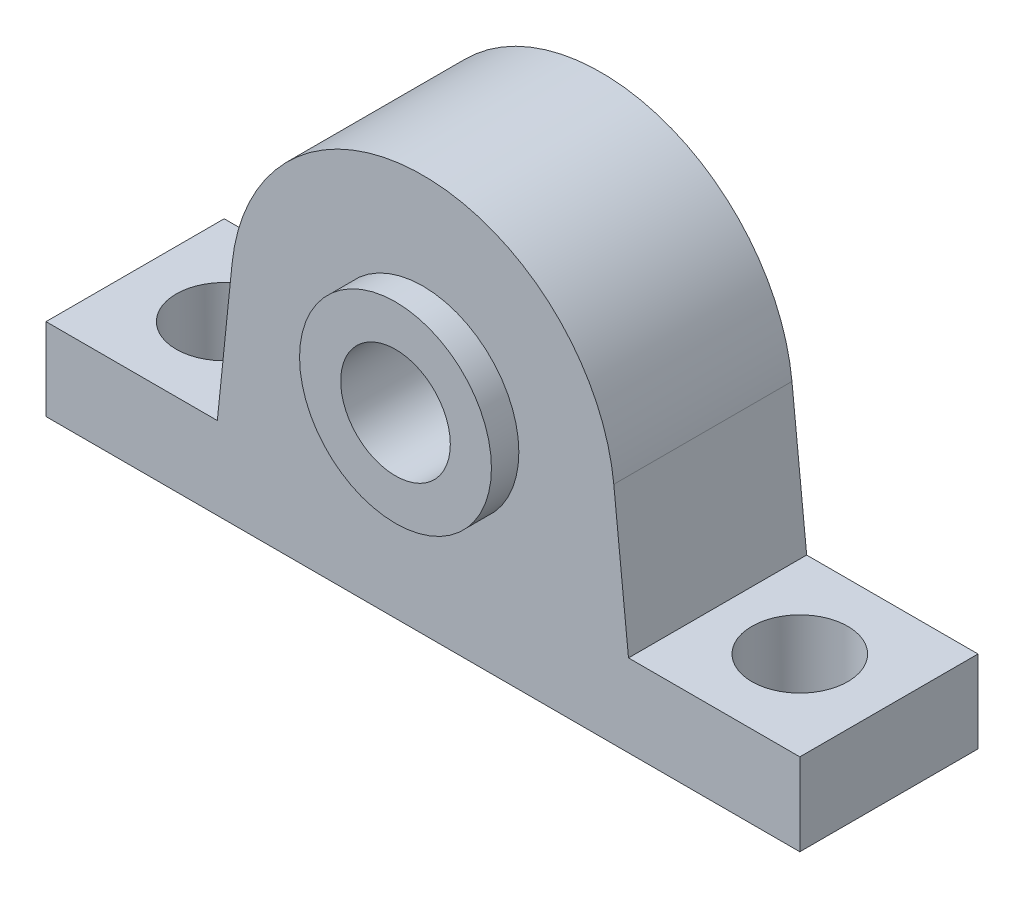
ISO-10303-21;
HEADER;
FILE_DESCRIPTION(('STEP AP214'),'2;1');
FILE_NAME('part.step','',(''),(''),'','','');
FILE_SCHEMA(('AUTOMOTIVE_DESIGN { 1 0 10303 214 1 1 1 1 }'));
ENDSEC;
DATA;
#1=APPLICATION_CONTEXT('core data for automotive mechanical design processes');
#2=APPLICATION_PROTOCOL_DEFINITION('international standard','automotive_design',2000,#1);
#3=PRODUCT_CONTEXT('',#1,'mechanical');
#4=PRODUCT('Part','Part','',(#3));
#5=PRODUCT_RELATED_PRODUCT_CATEGORY('part','',(#4));
#6=PRODUCT_DEFINITION_FORMATION('','',#4);
#7=PRODUCT_DEFINITION_CONTEXT('part definition',#1,'design');
#8=PRODUCT_DEFINITION('design','',#6,#7);
#9=PRODUCT_DEFINITION_SHAPE('','',#8);
#10=(LENGTH_UNIT() NAMED_UNIT(*) SI_UNIT(.MILLI.,.METRE.));
#11=(NAMED_UNIT(*) PLANE_ANGLE_UNIT() SI_UNIT($,.RADIAN.));
#12=(NAMED_UNIT(*) SI_UNIT($,.STERADIAN.) SOLID_ANGLE_UNIT());
#13=UNCERTAINTY_MEASURE_WITH_UNIT(LENGTH_MEASURE(1.E-05),#10,'distance_accuracy_value','');
#14=(GEOMETRIC_REPRESENTATION_CONTEXT(3) GLOBAL_UNCERTAINTY_ASSIGNED_CONTEXT((#13)) GLOBAL_UNIT_ASSIGNED_CONTEXT((#10,
#11,#12)) REPRESENTATION_CONTEXT('',''));
#15=CARTESIAN_POINT('',(0.,0.,0.));
#16=DIRECTION('',(0.,0.,1.));
#17=DIRECTION('',(1.,0.,0.));
#18=AXIS2_PLACEMENT_3D('',#15,#16,#17);
#19=CARTESIAN_POINT('',(0.,0.,6.5));
#20=DIRECTION('',(0.,0.,1.));
#21=DIRECTION('',(1.,0.,0.));
#22=AXIS2_PLACEMENT_3D('',#19,#20,#21);
#23=PLANE('',#22);
#24=DIRECTION('',(0.,-1.,0.));
#25=VECTOR('',#24,1.);
#26=CARTESIAN_POINT('',(-27.5,-9.,6.5));
#27=LINE('',#26,#25);
#28=CARTESIAN_POINT('',(-27.5,-9.,6.5));
#29=VERTEX_POINT('',#28);
#30=CARTESIAN_POINT('',(-27.5,-15.,6.5));
#31=VERTEX_POINT('',#30);
#32=EDGE_CURVE('E82',#29,#31,#27,.T.);
#33=ORIENTED_EDGE('',*,*,#32,.T.);
#34=DIRECTION('',(1.,0.,0.));
#35=VECTOR('',#34,1.);
#36=CARTESIAN_POINT('',(-27.5,-15.,6.5));
#37=LINE('',#36,#35);
#38=CARTESIAN_POINT('',(27.5,-15.,6.5));
#39=VERTEX_POINT('',#38);
#40=EDGE_CURVE('E90',#31,#39,#37,.T.);
#41=ORIENTED_EDGE('',*,*,#40,.T.);
#42=DIRECTION('',(0.,1.,0.));
#43=VECTOR('',#42,1.);
#44=CARTESIAN_POINT('',(27.5,-9.,6.5));
#45=LINE('',#44,#43);
#46=CARTESIAN_POINT('',(27.5,-9.,6.5));
#47=VERTEX_POINT('',#46);
#48=EDGE_CURVE('E95',#39,#47,#45,.T.);
#49=ORIENTED_EDGE('',*,*,#48,.T.);
#50=DIRECTION('',(-1.,0.,0.));
#51=VECTOR('',#50,1.);
#52=CARTESIAN_POINT('',(15.,-9.,6.5));
#53=LINE('',#52,#51);
#54=CARTESIAN_POINT('',(15.,-9.,6.5));
#55=VERTEX_POINT('',#54);
#56=EDGE_CURVE('E109',#47,#55,#53,.T.);
#57=ORIENTED_EDGE('',*,*,#56,.T.);
#58=DIRECTION('',(-0.102357278514779,0.994747700442202,0.));
#59=VECTOR('',#58,1.);
#60=CARTESIAN_POINT('',(13.9264678061908,1.43300189920692,6.5));
#61=LINE('',#60,#59);
#62=CARTESIAN_POINT('',(13.9264678061908,1.43300189920692,6.5));
#63=VERTEX_POINT('',#62);
#64=EDGE_CURVE('E112',#55,#63,#61,.T.);
#65=ORIENTED_EDGE('',*,*,#64,.T.);
#66=CARTESIAN_POINT('',(0.,0.,6.5));
#67=DIRECTION('',(0.,0.,1.));
#68=DIRECTION('',(1.,0.,0.));
#69=AXIS2_PLACEMENT_3D('',#66,#67,#68);
#70=CIRCLE('',#69,14.);
#71=CARTESIAN_POINT('',(-13.9264678061908,1.43300189920691,6.5));
#72=VERTEX_POINT('',#71);
#73=EDGE_CURVE('E115',#63,#72,#70,.T.);
#74=ORIENTED_EDGE('',*,*,#73,.T.);
#75=DIRECTION('',(-0.102357278514779,-0.994747700442202,0.));
#76=VECTOR('',#75,1.);
#77=CARTESIAN_POINT('',(-13.9264678061908,1.43300189920691,6.5));
#78=LINE('',#77,#76);
#79=CARTESIAN_POINT('',(-15.,-9.,6.5));
#80=VERTEX_POINT('',#79);
#81=EDGE_CURVE('E118',#72,#80,#78,.T.);
#82=ORIENTED_EDGE('',*,*,#81,.T.);
#83=DIRECTION('',(-1.,0.,0.));
#84=VECTOR('',#83,1.);
#85=CARTESIAN_POINT('',(-27.5,-9.,6.5));
#86=LINE('',#85,#84);
#87=EDGE_CURVE('E100',#80,#29,#86,.T.);
#88=ORIENTED_EDGE('',*,*,#87,.T.);
#89=EDGE_LOOP('',(#33,#41,#49,#57,#65,#74,#82,#88));
#90=FACE_BOUND('',#89,.T.);
#91=CARTESIAN_POINT('',(0.,0.,6.5));
#92=DIRECTION('',(0.,0.,1.));
#93=DIRECTION('',(1.,0.,0.));
#94=AXIS2_PLACEMENT_3D('',#91,#92,#93);
#95=CIRCLE('',#94,7.);
#96=CARTESIAN_POINT('',(7.,0.,6.5));
#97=VERTEX_POINT('',#96);
#98=EDGE_CURVE('E210',#97,#97,#95,.T.);
#99=ORIENTED_EDGE('',*,*,#98,.F.);
#100=EDGE_LOOP('',(#99));
#101=FACE_BOUND('',#100,.T.);
#102=ADVANCED_FACE('F17',(#90,#101),#23,.T.);
#103=CARTESIAN_POINT('',(-27.5,-9.,-6.5));
#104=DIRECTION('',(-1.,0.,0.));
#105=DIRECTION('',(0.,0.,1.));
#106=AXIS2_PLACEMENT_3D('',#103,#104,#105);
#107=PLANE('',#106);
#108=DIRECTION('',(0.,0.,1.));
#109=VECTOR('',#108,1.);
#110=CARTESIAN_POINT('',(-27.5,-15.,-6.5));
#111=LINE('',#110,#109);
#112=CARTESIAN_POINT('',(-27.5,-15.,-6.5));
#113=VERTEX_POINT('',#112);
#114=EDGE_CURVE('E21',#113,#31,#111,.T.);
#115=ORIENTED_EDGE('',*,*,#114,.T.);
#116=ORIENTED_EDGE('',*,*,#32,.F.);
#117=DIRECTION('',(0.,0.,1.));
#118=VECTOR('',#117,1.);
#119=CARTESIAN_POINT('',(-27.5,-9.,-6.5));
#120=LINE('',#119,#118);
#121=CARTESIAN_POINT('',(-27.5,-9.,-6.5));
#122=VERTEX_POINT('',#121);
#123=EDGE_CURVE('E11',#122,#29,#120,.T.);
#124=ORIENTED_EDGE('',*,*,#123,.F.);
#125=DIRECTION('',(0.,-1.,0.));
#126=VECTOR('',#125,1.);
#127=CARTESIAN_POINT('',(-27.5,-9.,-6.5));
#128=LINE('',#127,#126);
#129=EDGE_CURVE('E83',#122,#113,#128,.T.);
#130=ORIENTED_EDGE('',*,*,#129,.T.);
#131=EDGE_LOOP('',(#115,#116,#124,#130));
#132=FACE_BOUND('',#131,.T.);
#133=ADVANCED_FACE('F19',(#132),#107,.T.);
#134=CARTESIAN_POINT('',(-27.5,-9.,-6.5));
#135=DIRECTION('',(0.,1.,0.));
#136=DIRECTION('',(-1.,0.,0.));
#137=AXIS2_PLACEMENT_3D('',#134,#135,#136);
#138=PLANE('',#137);
#139=CARTESIAN_POINT('',(-21.,-9.,0.));
#140=DIRECTION('',(0.,1.,0.));
#141=DIRECTION('',(-1.,0.,0.));
#142=AXIS2_PLACEMENT_3D('',#139,#140,#141);
#143=CIRCLE('',#142,3.5);
#144=CARTESIAN_POINT('',(-24.5,-9.,0.));
#145=VERTEX_POINT('',#144);
#146=EDGE_CURVE('E101',#145,#145,#143,.T.);
#147=ORIENTED_EDGE('',*,*,#146,.F.);
#148=EDGE_LOOP('',(#147));
#149=FACE_BOUND('',#148,.T.);
#150=ORIENTED_EDGE('',*,*,#123,.T.);
#151=ORIENTED_EDGE('',*,*,#87,.F.);
#152=DIRECTION('',(0.,0.,1.));
#153=VECTOR('',#152,1.);
#154=CARTESIAN_POINT('',(-15.,-9.,-6.5));
#155=LINE('',#154,#153);
#156=CARTESIAN_POINT('',(-15.,-9.,-6.5));
#157=VERTEX_POINT('',#156);
#158=EDGE_CURVE('E26',#157,#80,#155,.T.);
#159=ORIENTED_EDGE('',*,*,#158,.F.);
#160=DIRECTION('',(-1.,0.,0.));
#161=VECTOR('',#160,1.);
#162=CARTESIAN_POINT('',(-27.5,-9.,-6.5));
#163=LINE('',#162,#161);
#164=EDGE_CURVE('E88',#157,#122,#163,.T.);
#165=ORIENTED_EDGE('',*,*,#164,.T.);
#166=EDGE_LOOP('',(#150,#151,#159,#165));
#167=FACE_BOUND('',#166,.T.);
#168=ADVANCED_FACE('F172',(#149,#167),#138,.T.);
#169=CARTESIAN_POINT('',(-13.9264678061908,1.43300189920691,-6.5));
#170=DIRECTION('',(-0.994747700442202,0.102357278514779,0.));
#171=DIRECTION('',(-0.102357278514779,-0.994747700442202,0.));
#172=AXIS2_PLACEMENT_3D('',#169,#170,#171);
#173=PLANE('',#172);
#174=ORIENTED_EDGE('',*,*,#158,.T.);
#175=ORIENTED_EDGE('',*,*,#81,.F.);
#176=DIRECTION('',(0.,0.,1.));
#177=VECTOR('',#176,1.);
#178=CARTESIAN_POINT('',(-13.9264678061908,1.43300189920691,-6.5));
#179=LINE('',#178,#177);
#180=CARTESIAN_POINT('',(-13.9264678061908,1.43300189920691,-6.5));
#181=VERTEX_POINT('',#180);
#182=EDGE_CURVE('E143',#181,#72,#179,.T.);
#183=ORIENTED_EDGE('',*,*,#182,.F.);
#184=DIRECTION('',(-0.102357278514779,-0.994747700442202,0.));
#185=VECTOR('',#184,1.);
#186=CARTESIAN_POINT('',(-13.9264678061908,1.43300189920691,-6.5));
#187=LINE('',#186,#185);
#188=EDGE_CURVE('E139',#181,#157,#187,.T.);
#189=ORIENTED_EDGE('',*,*,#188,.T.);
#190=EDGE_LOOP('',(#174,#175,#183,#189));
#191=FACE_BOUND('',#190,.T.);
#192=ADVANCED_FACE('F171',(#191),#173,.T.);
#193=CARTESIAN_POINT('',(0.,0.,-6.5));
#194=DIRECTION('',(0.,0.,1.));
#195=DIRECTION('',(1.,0.,0.));
#196=AXIS2_PLACEMENT_3D('',#193,#194,#195);
#197=CYLINDRICAL_SURFACE('',#196,14.);
#198=ORIENTED_EDGE('',*,*,#182,.T.);
#199=ORIENTED_EDGE('',*,*,#73,.F.);
#200=DIRECTION('',(0.,0.,1.));
#201=VECTOR('',#200,1.);
#202=CARTESIAN_POINT('',(13.9264678061908,1.43300189920692,-6.5));
#203=LINE('',#202,#201);
#204=CARTESIAN_POINT('',(13.9264678061908,1.43300189920692,-6.5));
#205=VERTEX_POINT('',#204);
#206=EDGE_CURVE('E145',#205,#63,#203,.T.);
#207=ORIENTED_EDGE('',*,*,#206,.F.);
#208=CARTESIAN_POINT('',(0.,0.,-6.5));
#209=DIRECTION('',(0.,0.,1.));
#210=DIRECTION('',(1.,0.,0.));
#211=AXIS2_PLACEMENT_3D('',#208,#209,#210);
#212=CIRCLE('',#211,14.);
#213=EDGE_CURVE('E136',#205,#181,#212,.T.);
#214=ORIENTED_EDGE('',*,*,#213,.T.);
#215=EDGE_LOOP('',(#198,#199,#207,#214));
#216=FACE_BOUND('',#215,.T.);
#217=ADVANCED_FACE('F167',(#216),#197,.T.);
#218=CARTESIAN_POINT('',(13.9264678061908,1.43300189920692,-6.5));
#219=DIRECTION('',(0.994747700442202,0.102357278514779,0.));
#220=DIRECTION('',(-0.102357278514779,0.994747700442202,0.));
#221=AXIS2_PLACEMENT_3D('',#218,#219,#220);
#222=PLANE('',#221);
#223=ORIENTED_EDGE('',*,*,#206,.T.);
#224=ORIENTED_EDGE('',*,*,#64,.F.);
#225=DIRECTION('',(0.,0.,1.));
#226=VECTOR('',#225,1.);
#227=CARTESIAN_POINT('',(15.,-9.,-6.5));
#228=LINE('',#227,#226);
#229=CARTESIAN_POINT('',(15.,-9.,-6.5));
#230=VERTEX_POINT('',#229);
#231=EDGE_CURVE('E147',#230,#55,#228,.T.);
#232=ORIENTED_EDGE('',*,*,#231,.F.);
#233=DIRECTION('',(-0.102357278514779,0.994747700442202,0.));
#234=VECTOR('',#233,1.);
#235=CARTESIAN_POINT('',(13.9264678061908,1.43300189920692,-6.5));
#236=LINE('',#235,#234);
#237=EDGE_CURVE('E133',#230,#205,#236,.T.);
#238=ORIENTED_EDGE('',*,*,#237,.T.);
#239=EDGE_LOOP('',(#223,#224,#232,#238));
#240=FACE_BOUND('',#239,.T.);
#241=ADVANCED_FACE('F160',(#240),#222,.T.);
#242=CARTESIAN_POINT('',(15.,-9.,-6.5));
#243=DIRECTION('',(0.,1.,0.));
#244=DIRECTION('',(-1.,0.,0.));
#245=AXIS2_PLACEMENT_3D('',#242,#243,#244);
#246=PLANE('',#245);
#247=CARTESIAN_POINT('',(21.,-9.,0.));
#248=DIRECTION('',(0.,1.,0.));
#249=DIRECTION('',(-1.,0.,0.));
#250=AXIS2_PLACEMENT_3D('',#247,#248,#249);
#251=CIRCLE('',#250,3.5);
#252=CARTESIAN_POINT('',(17.5,-9.,0.));
#253=VERTEX_POINT('',#252);
#254=EDGE_CURVE('E221',#253,#253,#251,.T.);
#255=ORIENTED_EDGE('',*,*,#254,.F.);
#256=EDGE_LOOP('',(#255));
#257=FACE_BOUND('',#256,.T.);
#258=ORIENTED_EDGE('',*,*,#231,.T.);
#259=ORIENTED_EDGE('',*,*,#56,.F.);
#260=DIRECTION('',(0.,0.,1.));
#261=VECTOR('',#260,1.);
#262=CARTESIAN_POINT('',(27.5,-9.,-6.5));
#263=LINE('',#262,#261);
#264=CARTESIAN_POINT('',(27.5,-9.,-6.5));
#265=VERTEX_POINT('',#264);
#266=EDGE_CURVE('E149',#265,#47,#263,.T.);
#267=ORIENTED_EDGE('',*,*,#266,.F.);
#268=DIRECTION('',(-1.,0.,0.));
#269=VECTOR('',#268,1.);
#270=CARTESIAN_POINT('',(15.,-9.,-6.5));
#271=LINE('',#270,#269);
#272=EDGE_CURVE('E130',#265,#230,#271,.T.);
#273=ORIENTED_EDGE('',*,*,#272,.T.);
#274=EDGE_LOOP('',(#258,#259,#267,#273));
#275=FACE_BOUND('',#274,.T.);
#276=ADVANCED_FACE('F157',(#257,#275),#246,.T.);
#277=CARTESIAN_POINT('',(27.5,-9.,-6.5));
#278=DIRECTION('',(1.,0.,0.));
#279=DIRECTION('',(0.,0.,-1.));
#280=AXIS2_PLACEMENT_3D('',#277,#278,#279);
#281=PLANE('',#280);
#282=ORIENTED_EDGE('',*,*,#266,.T.);
#283=ORIENTED_EDGE('',*,*,#48,.F.);
#284=DIRECTION('',(0.,0.,1.));
#285=VECTOR('',#284,1.);
#286=CARTESIAN_POINT('',(27.5,-15.,-6.5));
#287=LINE('',#286,#285);
#288=CARTESIAN_POINT('',(27.5,-15.,-6.5));
#289=VERTEX_POINT('',#288);
#290=EDGE_CURVE('E87',#289,#39,#287,.T.);
#291=ORIENTED_EDGE('',*,*,#290,.F.);
#292=DIRECTION('',(0.,1.,0.));
#293=VECTOR('',#292,1.);
#294=CARTESIAN_POINT('',(27.5,-9.,-6.5));
#295=LINE('',#294,#293);
#296=EDGE_CURVE('E127',#289,#265,#295,.T.);
#297=ORIENTED_EDGE('',*,*,#296,.T.);
#298=EDGE_LOOP('',(#282,#283,#291,#297));
#299=FACE_BOUND('',#298,.T.);
#300=ADVANCED_FACE('F151',(#299),#281,.T.);
#301=CARTESIAN_POINT('',(-27.5,-15.,-6.5));
#302=DIRECTION('',(0.,-1.,0.));
#303=DIRECTION('',(1.,0.,0.));
#304=AXIS2_PLACEMENT_3D('',#301,#302,#303);
#305=PLANE('',#304);
#306=CARTESIAN_POINT('',(21.,-15.,0.));
#307=DIRECTION('',(0.,1.,0.));
#308=DIRECTION('',(0.,0.,1.));
#309=AXIS2_PLACEMENT_3D('',#306,#307,#308);
#310=CIRCLE('',#309,3.5);
#311=CARTESIAN_POINT('',(21.,-15.,3.49999999999999));
#312=VERTEX_POINT('',#311);
#313=EDGE_CURVE('E217',#312,#312,#310,.T.);
#314=ORIENTED_EDGE('',*,*,#313,.T.);
#315=EDGE_LOOP('',(#314));
#316=FACE_BOUND('',#315,.T.);
#317=CARTESIAN_POINT('',(-21.,-15.,0.));
#318=DIRECTION('',(0.,1.,0.));
#319=DIRECTION('',(0.,0.,1.));
#320=AXIS2_PLACEMENT_3D('',#317,#318,#319);
#321=CIRCLE('',#320,3.5);
#322=CARTESIAN_POINT('',(-21.,-15.,3.5));
#323=VERTEX_POINT('',#322);
#324=EDGE_CURVE('E104',#323,#323,#321,.T.);
#325=ORIENTED_EDGE('',*,*,#324,.T.);
#326=EDGE_LOOP('',(#325));
#327=FACE_BOUND('',#326,.T.);
#328=ORIENTED_EDGE('',*,*,#290,.T.);
#329=ORIENTED_EDGE('',*,*,#40,.F.);
#330=ORIENTED_EDGE('',*,*,#114,.F.);
#331=DIRECTION('',(1.,0.,0.));
#332=VECTOR('',#331,1.);
#333=CARTESIAN_POINT('',(-27.5,-15.,-6.5));
#334=LINE('',#333,#332);
#335=EDGE_CURVE('E125',#113,#289,#334,.T.);
#336=ORIENTED_EDGE('',*,*,#335,.T.);
#337=EDGE_LOOP('',(#328,#329,#330,#336));
#338=FACE_BOUND('',#337,.T.);
#339=ADVANCED_FACE('F91',(#316,#327,#338),#305,.T.);
#340=CARTESIAN_POINT('',(0.,0.,-6.5));
#341=DIRECTION('',(0.,0.,1.));
#342=DIRECTION('',(1.,0.,0.));
#343=AXIS2_PLACEMENT_3D('',#340,#341,#342);
#344=PLANE('',#343);
#345=CARTESIAN_POINT('',(0.,0.,-6.5));
#346=DIRECTION('',(0.,0.,1.));
#347=DIRECTION('',(1.,0.,0.));
#348=AXIS2_PLACEMENT_3D('',#345,#346,#347);
#349=CIRCLE('',#348,4.);
#350=CARTESIAN_POINT('',(4.,0.,-6.5));
#351=VERTEX_POINT('',#350);
#352=EDGE_CURVE('E121',#351,#351,#349,.T.);
#353=ORIENTED_EDGE('',*,*,#352,.T.);
#354=EDGE_LOOP('',(#353));
#355=FACE_BOUND('',#354,.T.);
#356=ORIENTED_EDGE('',*,*,#129,.F.);
#357=ORIENTED_EDGE('',*,*,#164,.F.);
#358=ORIENTED_EDGE('',*,*,#188,.F.);
#359=ORIENTED_EDGE('',*,*,#213,.F.);
#360=ORIENTED_EDGE('',*,*,#237,.F.);
#361=ORIENTED_EDGE('',*,*,#272,.F.);
#362=ORIENTED_EDGE('',*,*,#296,.F.);
#363=ORIENTED_EDGE('',*,*,#335,.F.);
#364=EDGE_LOOP('',(#356,#357,#358,#359,#360,#361,#362,#363));
#365=FACE_BOUND('',#364,.T.);
#366=ADVANCED_FACE('F163',(#355,#365),#344,.F.);
#367=CARTESIAN_POINT('',(0.,0.,-6.5));
#368=DIRECTION('',(0.,0.,1.));
#369=DIRECTION('',(1.,0.,0.));
#370=AXIS2_PLACEMENT_3D('',#367,#368,#369);
#371=CYLINDRICAL_SURFACE('',#370,4.);
#372=ORIENTED_EDGE('',*,*,#352,.F.);
#373=EDGE_LOOP('',(#372));
#374=FACE_BOUND('',#373,.T.);
#375=CARTESIAN_POINT('',(0.,0.,8.5));
#376=DIRECTION('',(0.,0.,1.));
#377=DIRECTION('',(1.,0.,0.));
#378=AXIS2_PLACEMENT_3D('',#375,#376,#377);
#379=CIRCLE('',#378,4.);
#380=CARTESIAN_POINT('',(4.,0.,8.5));
#381=VERTEX_POINT('',#380);
#382=EDGE_CURVE('E208',#381,#381,#379,.T.);
#383=ORIENTED_EDGE('',*,*,#382,.T.);
#384=EDGE_LOOP('',(#383));
#385=FACE_BOUND('',#384,.T.);
#386=ADVANCED_FACE('F194',(#374,#385),#371,.F.);
#387=CARTESIAN_POINT('',(-21.,-15.,0.));
#388=DIRECTION('',(0.,1.,0.));
#389=DIRECTION('',(0.,0.,1.));
#390=AXIS2_PLACEMENT_3D('',#387,#388,#389);
#391=CYLINDRICAL_SURFACE('',#390,3.5);
#392=ORIENTED_EDGE('',*,*,#146,.T.);
#393=EDGE_LOOP('',(#392));
#394=FACE_BOUND('',#393,.T.);
#395=ORIENTED_EDGE('',*,*,#324,.F.);
#396=EDGE_LOOP('',(#395));
#397=FACE_BOUND('',#396,.T.);
#398=ADVANCED_FACE('F192',(#394,#397),#391,.F.);
#399=CARTESIAN_POINT('',(21.,-15.,0.));
#400=DIRECTION('',(0.,1.,0.));
#401=DIRECTION('',(0.,0.,1.));
#402=AXIS2_PLACEMENT_3D('',#399,#400,#401);
#403=CYLINDRICAL_SURFACE('',#402,3.5);
#404=ORIENTED_EDGE('',*,*,#254,.T.);
#405=EDGE_LOOP('',(#404));
#406=FACE_BOUND('',#405,.T.);
#407=ORIENTED_EDGE('',*,*,#313,.F.);
#408=EDGE_LOOP('',(#407));
#409=FACE_BOUND('',#408,.T.);
#410=ADVANCED_FACE('F228',(#406,#409),#403,.F.);
#411=CARTESIAN_POINT('',(0.,0.,8.5));
#412=DIRECTION('',(0.,0.,1.));
#413=DIRECTION('',(1.,0.,0.));
#414=AXIS2_PLACEMENT_3D('',#411,#412,#413);
#415=PLANE('',#414);
#416=CARTESIAN_POINT('',(0.,0.,8.5));
#417=DIRECTION('',(0.,0.,1.));
#418=DIRECTION('',(1.,0.,0.));
#419=AXIS2_PLACEMENT_3D('',#416,#417,#418);
#420=CIRCLE('',#419,7.);
#421=CARTESIAN_POINT('',(7.,0.,8.5));
#422=VERTEX_POINT('',#421);
#423=EDGE_CURVE('E213',#422,#422,#420,.T.);
#424=ORIENTED_EDGE('',*,*,#423,.T.);
#425=EDGE_LOOP('',(#424));
#426=FACE_BOUND('',#425,.T.);
#427=ORIENTED_EDGE('',*,*,#382,.F.);
#428=EDGE_LOOP('',(#427));
#429=FACE_BOUND('',#428,.T.);
#430=ADVANCED_FACE('F234',(#426,#429),#415,.T.);
#431=CARTESIAN_POINT('',(0.,0.,8.5));
#432=DIRECTION('',(0.,0.,-1.));
#433=DIRECTION('',(-1.,0.,0.));
#434=AXIS2_PLACEMENT_3D('',#431,#432,#433);
#435=CYLINDRICAL_SURFACE('',#434,7.);
#436=ORIENTED_EDGE('',*,*,#423,.F.);
#437=EDGE_LOOP('',(#436));
#438=FACE_BOUND('',#437,.T.);
#439=ORIENTED_EDGE('',*,*,#98,.T.);
#440=EDGE_LOOP('',(#439));
#441=FACE_BOUND('',#440,.T.);
#442=ADVANCED_FACE('F240',(#438,#441),#435,.T.);
#443=CLOSED_SHELL('',(#102,#133,#168,#192,#217,#241,#276,#300,#339,#366,#386,#398,#410,#430,#442));
#444=MANIFOLD_SOLID_BREP('B1',#443);
#445=ADVANCED_BREP_SHAPE_REPRESENTATION('',(#18,#444),#14);
#446=SHAPE_DEFINITION_REPRESENTATION(#9,#445);
ENDSEC;
END-ISO-10303-21;
